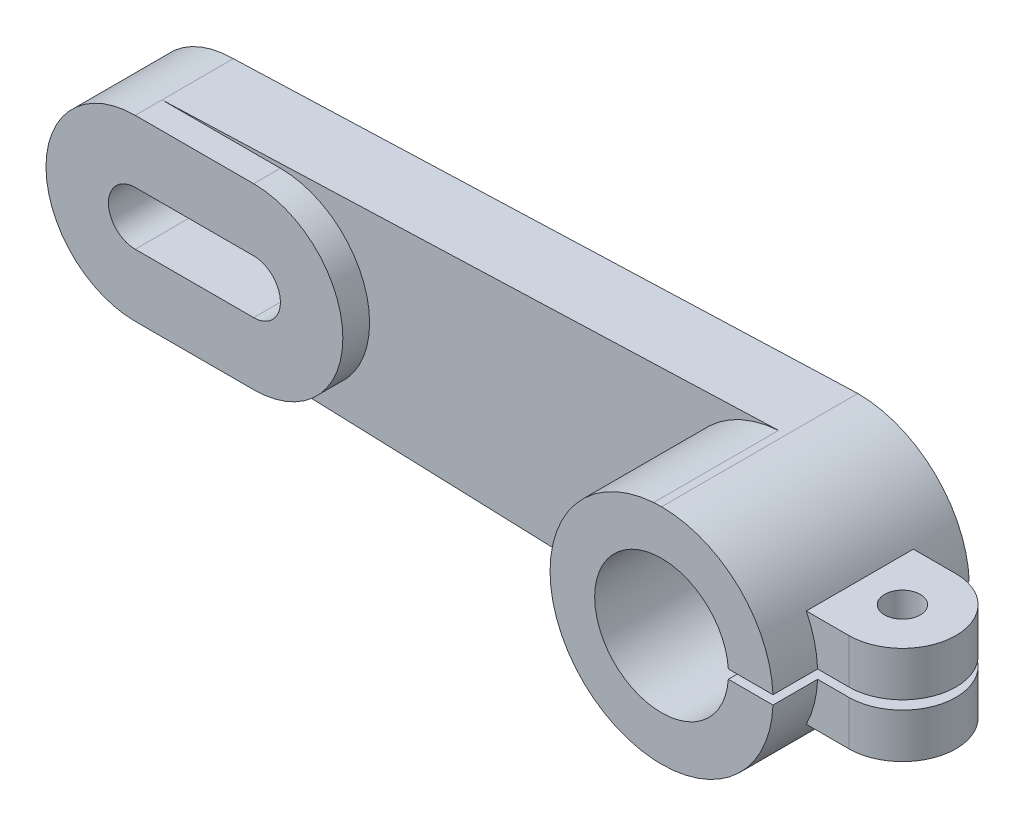
ISO-10303-21;
HEADER;
FILE_DESCRIPTION(('STEP AP214'),'2;1');
FILE_NAME('part.step','',(''),(''),'','','');
FILE_SCHEMA(('AUTOMOTIVE_DESIGN { 1 0 10303 214 1 1 1 1 }'));
ENDSEC;
DATA;
#1=APPLICATION_CONTEXT('core data for automotive mechanical design processes');
#2=APPLICATION_PROTOCOL_DEFINITION('international standard','automotive_design',2000,#1);
#3=PRODUCT_CONTEXT('',#1,'mechanical');
#4=PRODUCT('Part','Part','',(#3));
#5=PRODUCT_RELATED_PRODUCT_CATEGORY('part','',(#4));
#6=PRODUCT_DEFINITION_FORMATION('','',#4);
#7=PRODUCT_DEFINITION_CONTEXT('part definition',#1,'design');
#8=PRODUCT_DEFINITION('design','',#6,#7);
#9=PRODUCT_DEFINITION_SHAPE('','',#8);
#10=(LENGTH_UNIT() NAMED_UNIT(*) SI_UNIT(.MILLI.,.METRE.));
#11=(NAMED_UNIT(*) PLANE_ANGLE_UNIT() SI_UNIT($,.RADIAN.));
#12=(NAMED_UNIT(*) SI_UNIT($,.STERADIAN.) SOLID_ANGLE_UNIT());
#13=UNCERTAINTY_MEASURE_WITH_UNIT(LENGTH_MEASURE(1.E-05),#10,'distance_accuracy_value','');
#14=(GEOMETRIC_REPRESENTATION_CONTEXT(3) GLOBAL_UNCERTAINTY_ASSIGNED_CONTEXT((#13)) GLOBAL_UNIT_ASSIGNED_CONTEXT((#10,
#11,#12)) REPRESENTATION_CONTEXT('',''));
#15=CARTESIAN_POINT('',(0.,0.,0.));
#16=DIRECTION('',(0.,0.,1.));
#17=DIRECTION('',(1.,0.,0.));
#18=AXIS2_PLACEMENT_3D('',#15,#16,#17);
#19=CARTESIAN_POINT('',(140.,0.,16.));
#20=DIRECTION('',(0.,0.,-1.));
#21=DIRECTION('',(-1.,0.,0.));
#22=AXIS2_PLACEMENT_3D('',#19,#20,#21);
#23=CYLINDRICAL_SURFACE('',#22,25.);
#24=CARTESIAN_POINT('',(140.,0.,0.));
#25=DIRECTION('',(0.,0.,1.));
#26=DIRECTION('',(1.,0.,0.));
#27=AXIS2_PLACEMENT_3D('',#24,#25,#26);
#28=CIRCLE('',#27,25.);
#29=CARTESIAN_POINT('',(140.,-25.,0.));
#30=VERTEX_POINT('',#29);
#31=CARTESIAN_POINT('',(164.979991993594,-0.999999999999997,0.));
#32=VERTEX_POINT('',#31);
#33=EDGE_CURVE('E322',#30,#32,#28,.T.);
#34=ORIENTED_EDGE('',*,*,#33,.T.);
#35=DIRECTION('',(0.,0.,-1.));
#36=VECTOR('',#35,1.);
#37=CARTESIAN_POINT('',(164.979991993594,-0.999999999999997,16.));
#38=LINE('',#37,#36);
#39=CARTESIAN_POINT('',(164.979991993594,-0.999999999999997,9.99999999999999));
#40=VERTEX_POINT('',#39);
#41=EDGE_CURVE('E281',#32,#40,#38,.F.);
#42=ORIENTED_EDGE('',*,*,#41,.T.);
#43=CARTESIAN_POINT('',(140.,0.,9.99999999999999));
#44=DIRECTION('',(0.,0.,1.));
#45=DIRECTION('',(1.,0.,0.));
#46=AXIS2_PLACEMENT_3D('',#43,#44,#45);
#47=CIRCLE('',#46,25.);
#48=CARTESIAN_POINT('',(162.449944320644,-11.,9.99999999999999));
#49=VERTEX_POINT('',#48);
#50=EDGE_CURVE('E11',#49,#40,#47,.T.);
#51=ORIENTED_EDGE('',*,*,#50,.F.);
#52=DIRECTION('',(0.,0.,-1.));
#53=VECTOR('',#52,1.);
#54=CARTESIAN_POINT('',(162.449944320644,-11.,16.));
#55=LINE('',#54,#53);
#56=CARTESIAN_POINT('',(162.449944320644,-11.,34.));
#57=VERTEX_POINT('',#56);
#58=EDGE_CURVE('E346',#57,#49,#55,.T.);
#59=ORIENTED_EDGE('',*,*,#58,.F.);
#60=CARTESIAN_POINT('',(140.,0.,34.));
#61=DIRECTION('',(0.,0.,-1.));
#62=DIRECTION('',(-1.,0.,0.));
#63=AXIS2_PLACEMENT_3D('',#60,#61,#62);
#64=CIRCLE('',#63,25.);
#65=CARTESIAN_POINT('',(164.979991993594,-0.999999999999997,34.));
#66=VERTEX_POINT('',#65);
#67=EDGE_CURVE('E336',#66,#57,#64,.T.);
#68=ORIENTED_EDGE('',*,*,#67,.F.);
#69=CARTESIAN_POINT('',(164.979991993594,-0.999999999999997,44.));
#70=VERTEX_POINT('',#69);
#71=EDGE_CURVE('E62',#66,#70,#38,.F.);
#72=ORIENTED_EDGE('',*,*,#71,.T.);
#73=CARTESIAN_POINT('',(140.,0.,44.));
#74=DIRECTION('',(0.,0.,1.));
#75=DIRECTION('',(1.,0.,0.));
#76=AXIS2_PLACEMENT_3D('',#73,#74,#75);
#77=CIRCLE('',#76,25.);
#78=CARTESIAN_POINT('',(140.,-25.,44.));
#79=VERTEX_POINT('',#78);
#80=EDGE_CURVE('E232',#79,#70,#77,.T.);
#81=ORIENTED_EDGE('',*,*,#80,.F.);
#82=DIRECTION('',(0.,0.,-1.));
#83=VECTOR('',#82,1.);
#84=CARTESIAN_POINT('',(140.,-25.,16.));
#85=LINE('',#84,#83);
#86=EDGE_CURVE('E330',#79,#30,#85,.T.);
#87=ORIENTED_EDGE('',*,*,#86,.T.);
#88=EDGE_LOOP('',(#34,#42,#51,#59,#68,#72,#81,#87));
#89=FACE_BOUND('',#88,.T.);
#90=ADVANCED_FACE('F37',(#89),#23,.T.);
#91=CARTESIAN_POINT('',(172.,11.,22.));
#92=DIRECTION('',(0.,-1.,0.));
#93=DIRECTION('',(0.,0.,-1.));
#94=AXIS2_PLACEMENT_3D('',#91,#92,#93);
#95=CYLINDRICAL_SURFACE('',#94,12.);
#96=DIRECTION('',(0.,-1.,0.));
#97=VECTOR('',#96,1.);
#98=CARTESIAN_POINT('',(172.,11.,9.99999999999999));
#99=LINE('',#98,#97);
#100=CARTESIAN_POINT('',(172.,-0.999999999999997,9.99999999999999));
#101=VERTEX_POINT('',#100);
#102=CARTESIAN_POINT('',(172.,-11.,9.99999999999999));
#103=VERTEX_POINT('',#102);
#104=EDGE_CURVE('E251',#101,#103,#99,.T.);
#105=ORIENTED_EDGE('',*,*,#104,.F.);
#106=CARTESIAN_POINT('',(172.,-0.999999999999997,22.));
#107=DIRECTION('',(0.,-1.,0.));
#108=DIRECTION('',(0.,0.,-1.));
#109=AXIS2_PLACEMENT_3D('',#106,#107,#108);
#110=CIRCLE('',#109,12.);
#111=CARTESIAN_POINT('',(172.,-0.999999999999997,34.));
#112=VERTEX_POINT('',#111);
#113=EDGE_CURVE('E286',#101,#112,#110,.T.);
#114=ORIENTED_EDGE('',*,*,#113,.T.);
#115=DIRECTION('',(0.,-1.,0.));
#116=VECTOR('',#115,1.);
#117=CARTESIAN_POINT('',(172.,11.,34.));
#118=LINE('',#117,#116);
#119=CARTESIAN_POINT('',(172.,-11.,34.));
#120=VERTEX_POINT('',#119);
#121=EDGE_CURVE('E255',#112,#120,#118,.T.);
#122=ORIENTED_EDGE('',*,*,#121,.T.);
#123=CARTESIAN_POINT('',(172.,-11.,22.));
#124=DIRECTION('',(0.,1.,0.));
#125=DIRECTION('',(0.,0.,1.));
#126=AXIS2_PLACEMENT_3D('',#123,#124,#125);
#127=CIRCLE('',#126,12.);
#128=EDGE_CURVE('E263',#120,#103,#127,.T.);
#129=ORIENTED_EDGE('',*,*,#128,.T.);
#130=EDGE_LOOP('',(#105,#114,#122,#129));
#131=FACE_BOUND('',#130,.T.);
#132=ADVANCED_FACE('F400',(#131),#95,.T.);
#133=CARTESIAN_POINT('',(172.,11.,9.99999999999999));
#134=DIRECTION('',(0.,0.,1.));
#135=DIRECTION('',(1.,0.,0.));
#136=AXIS2_PLACEMENT_3D('',#133,#134,#135);
#137=PLANE('',#136);
#138=ORIENTED_EDGE('',*,*,#50,.T.);
#139=DIRECTION('',(1.,0.,0.));
#140=VECTOR('',#139,1.);
#141=CARTESIAN_POINT('',(172.,-0.999999999999997,9.99999999999999));
#142=LINE('',#141,#140);
#143=EDGE_CURVE('E282',#40,#101,#142,.T.);
#144=ORIENTED_EDGE('',*,*,#143,.T.);
#145=ORIENTED_EDGE('',*,*,#104,.T.);
#146=DIRECTION('',(-1.,0.,0.));
#147=VECTOR('',#146,1.);
#148=CARTESIAN_POINT('',(172.,-11.,9.99999999999999));
#149=LINE('',#148,#147);
#150=EDGE_CURVE('E260',#103,#49,#149,.T.);
#151=ORIENTED_EDGE('',*,*,#150,.T.);
#152=EDGE_LOOP('',(#138,#144,#145,#151));
#153=FACE_BOUND('',#152,.T.);
#154=ADVANCED_FACE('F405',(#153),#137,.F.);
#155=CARTESIAN_POINT('',(172.,11.,34.));
#156=DIRECTION('',(0.,0.,-1.));
#157=DIRECTION('',(-1.,0.,0.));
#158=AXIS2_PLACEMENT_3D('',#155,#156,#157);
#159=PLANE('',#158);
#160=ORIENTED_EDGE('',*,*,#121,.F.);
#161=DIRECTION('',(-1.,0.,0.));
#162=VECTOR('',#161,1.);
#163=CARTESIAN_POINT('',(172.,-0.999999999999997,34.));
#164=LINE('',#163,#162);
#165=EDGE_CURVE('E289',#112,#66,#164,.T.);
#166=ORIENTED_EDGE('',*,*,#165,.T.);
#167=ORIENTED_EDGE('',*,*,#67,.T.);
#168=DIRECTION('',(1.,0.,0.));
#169=VECTOR('',#168,1.);
#170=CARTESIAN_POINT('',(172.,-11.,34.));
#171=LINE('',#170,#169);
#172=EDGE_CURVE('E256',#57,#120,#171,.T.);
#173=ORIENTED_EDGE('',*,*,#172,.T.);
#174=EDGE_LOOP('',(#160,#166,#167,#173));
#175=FACE_BOUND('',#174,.T.);
#176=ADVANCED_FACE('F419',(#175),#159,.F.);
#177=CARTESIAN_POINT('',(172.,11.,22.));
#178=DIRECTION('',(0.,-1.,0.));
#179=DIRECTION('',(0.,0.,-1.));
#180=AXIS2_PLACEMENT_3D('',#177,#178,#179);
#181=CYLINDRICAL_SURFACE('',#180,3.99999999999999);
#182=CARTESIAN_POINT('',(172.,-0.999999999999997,22.));
#183=DIRECTION('',(0.,-1.,0.));
#184=DIRECTION('',(0.,0.,-1.));
#185=AXIS2_PLACEMENT_3D('',#182,#183,#184);
#186=CIRCLE('',#185,3.99999999999999);
#187=CARTESIAN_POINT('',(172.,-0.999999999999997,18.));
#188=VERTEX_POINT('',#187);
#189=EDGE_CURVE('E41',#188,#188,#186,.T.);
#190=ORIENTED_EDGE('',*,*,#189,.F.);
#191=EDGE_LOOP('',(#190));
#192=FACE_BOUND('',#191,.T.);
#193=CARTESIAN_POINT('',(172.,-11.,22.));
#194=DIRECTION('',(0.,1.,0.));
#195=DIRECTION('',(0.,0.,1.));
#196=AXIS2_PLACEMENT_3D('',#193,#194,#195);
#197=CIRCLE('',#196,3.99999999999999);
#198=CARTESIAN_POINT('',(172.,-11.,26.));
#199=VERTEX_POINT('',#198);
#200=EDGE_CURVE('E274',#199,#199,#197,.T.);
#201=ORIENTED_EDGE('',*,*,#200,.F.);
#202=EDGE_LOOP('',(#201));
#203=FACE_BOUND('',#202,.T.);
#204=ADVANCED_FACE('F359',(#192,#203),#181,.F.);
#205=CARTESIAN_POINT('',(164.979991993594,1.,44.));
#206=VERTEX_POINT('',#205);
#207=CARTESIAN_POINT('',(140.,25.,44.));
#208=VERTEX_POINT('',#207);
#209=EDGE_CURVE('E222',#206,#208,#77,.T.);
#210=ORIENTED_EDGE('',*,*,#209,.F.);
#211=DIRECTION('',(0.,0.,-1.));
#212=VECTOR('',#211,1.);
#213=CARTESIAN_POINT('',(164.979991993594,1.,16.));
#214=LINE('',#213,#212);
#215=CARTESIAN_POINT('',(164.979991993594,1.,34.));
#216=VERTEX_POINT('',#215);
#217=EDGE_CURVE('E204',#206,#216,#214,.T.);
#218=ORIENTED_EDGE('',*,*,#217,.T.);
#219=CARTESIAN_POINT('',(162.449944320644,11.,34.));
#220=VERTEX_POINT('',#219);
#221=EDGE_CURVE('E344',#220,#216,#64,.T.);
#222=ORIENTED_EDGE('',*,*,#221,.F.);
#223=DIRECTION('',(0.,0.,-1.));
#224=VECTOR('',#223,1.);
#225=CARTESIAN_POINT('',(162.449944320644,11.,16.));
#226=LINE('',#225,#224);
#227=CARTESIAN_POINT('',(162.449944320644,11.,9.99999999999999));
#228=VERTEX_POINT('',#227);
#229=EDGE_CURVE('E349',#220,#228,#226,.T.);
#230=ORIENTED_EDGE('',*,*,#229,.T.);
#231=CARTESIAN_POINT('',(164.979991993594,1.,9.99999999999999));
#232=VERTEX_POINT('',#231);
#233=EDGE_CURVE('E46',#232,#228,#47,.T.);
#234=ORIENTED_EDGE('',*,*,#233,.F.);
#235=CARTESIAN_POINT('',(164.979991993594,1.,0.));
#236=VERTEX_POINT('',#235);
#237=EDGE_CURVE('E216',#232,#236,#214,.T.);
#238=ORIENTED_EDGE('',*,*,#237,.T.);
#239=CARTESIAN_POINT('',(140.,25.,0.));
#240=VERTEX_POINT('',#239);
#241=EDGE_CURVE('E312',#236,#240,#28,.T.);
#242=ORIENTED_EDGE('',*,*,#241,.T.);
#243=DIRECTION('',(0.,0.,-1.));
#244=VECTOR('',#243,1.);
#245=CARTESIAN_POINT('',(140.,25.,16.));
#246=LINE('',#245,#244);
#247=EDGE_CURVE('E230',#208,#240,#246,.T.);
#248=ORIENTED_EDGE('',*,*,#247,.F.);
#249=EDGE_LOOP('',(#210,#218,#222,#230,#234,#238,#242,#248));
#250=FACE_BOUND('',#249,.T.);
#251=ADVANCED_FACE('F228',(#250),#23,.T.);
#252=CARTESIAN_POINT('',(0.,0.,16.));
#253=DIRECTION('',(0.,0.,1.));
#254=DIRECTION('',(1.,0.,0.));
#255=AXIS2_PLACEMENT_3D('',#252,#253,#254);
#256=PLANE('',#255);
#257=DIRECTION('',(0.99936285434755,-0.0356915305124125,0.));
#258=VECTOR('',#257,1.);
#259=CARTESIAN_POINT('',(-0.713375796178345,-19.9745222929936,16.));
#260=LINE('',#259,#258);
#261=CARTESIAN_POINT('',(0.,-20.,16.));
#262=VERTEX_POINT('',#261);
#263=CARTESIAN_POINT('',(138.216560509554,-24.9363057324841,16.));
#264=VERTEX_POINT('',#263);
#265=EDGE_CURVE('E317',#262,#264,#260,.T.);
#266=ORIENTED_EDGE('',*,*,#265,.T.);
#267=CARTESIAN_POINT('',(140.,0.,16.));
#268=DIRECTION('',(0.,0.,1.));
#269=DIRECTION('',(1.,0.,0.));
#270=AXIS2_PLACEMENT_3D('',#267,#268,#269);
#271=CIRCLE('',#270,25.);
#272=CARTESIAN_POINT('',(138.216560509554,24.9363057324841,16.));
#273=VERTEX_POINT('',#272);
#274=EDGE_CURVE('E737',#264,#273,#271,.F.);
#275=ORIENTED_EDGE('',*,*,#274,.T.);
#276=DIRECTION('',(0.99936285434755,0.0356915305124125,0.));
#277=VECTOR('',#276,1.);
#278=CARTESIAN_POINT('',(-0.713375796178345,19.9745222929936,16.));
#279=LINE('',#278,#277);
#280=CARTESIAN_POINT('',(0.,20.,16.));
#281=VERTEX_POINT('',#280);
#282=EDGE_CURVE('E320',#281,#273,#279,.T.);
#283=ORIENTED_EDGE('',*,*,#282,.F.);
#284=DIRECTION('',(-1.,0.,0.));
#285=VECTOR('',#284,1.);
#286=CARTESIAN_POINT('',(0.,20.,16.));
#287=LINE('',#286,#285);
#288=CARTESIAN_POINT('',(26.54731064764,20.,16.));
#289=VERTEX_POINT('',#288);
#290=EDGE_CURVE('E734',#289,#281,#287,.T.);
#291=ORIENTED_EDGE('',*,*,#290,.F.);
#292=CARTESIAN_POINT('',(26.54731064764,0.,16.));
#293=DIRECTION('',(0.,0.,1.));
#294=DIRECTION('',(1.,0.,0.));
#295=AXIS2_PLACEMENT_3D('',#292,#293,#294);
#296=CIRCLE('',#295,20.);
#297=CARTESIAN_POINT('',(26.54731064764,-20.,16.));
#298=VERTEX_POINT('',#297);
#299=EDGE_CURVE('E743',#289,#298,#296,.F.);
#300=ORIENTED_EDGE('',*,*,#299,.T.);
#301=DIRECTION('',(-1.,0.,0.));
#302=VECTOR('',#301,1.);
#303=CARTESIAN_POINT('',(0.,-20.,16.));
#304=LINE('',#303,#302);
#305=EDGE_CURVE('E746',#298,#262,#304,.T.);
#306=ORIENTED_EDGE('',*,*,#305,.T.);
#307=EDGE_LOOP('',(#266,#275,#283,#291,#300,#306));
#308=FACE_BOUND('',#307,.T.);
#309=ADVANCED_FACE('F411',(#308),#256,.T.);
#310=CARTESIAN_POINT('',(0.,0.,16.));
#311=DIRECTION('',(0.,0.,-1.));
#312=DIRECTION('',(-1.,0.,0.));
#313=AXIS2_PLACEMENT_3D('',#310,#311,#312);
#314=CYLINDRICAL_SURFACE('',#313,20.);
#315=CARTESIAN_POINT('',(0.,0.,0.));
#316=DIRECTION('',(0.,0.,1.));
#317=DIRECTION('',(1.,0.,0.));
#318=AXIS2_PLACEMENT_3D('',#315,#316,#317);
#319=CIRCLE('',#318,20.);
#320=CARTESIAN_POINT('',(0.,20.,0.));
#321=VERTEX_POINT('',#320);
#322=CARTESIAN_POINT('',(0.,-20.,0.));
#323=VERTEX_POINT('',#322);
#324=EDGE_CURVE('E382',#321,#323,#319,.T.);
#325=ORIENTED_EDGE('',*,*,#324,.T.);
#326=DIRECTION('',(0.,0.,-1.));
#327=VECTOR('',#326,1.);
#328=CARTESIAN_POINT('',(0.,-20.,16.));
#329=LINE('',#328,#327);
#330=EDGE_CURVE('E333',#262,#323,#329,.T.);
#331=ORIENTED_EDGE('',*,*,#330,.F.);
#332=DIRECTION('',(0.,0.,-1.));
#333=VECTOR('',#332,1.);
#334=CARTESIAN_POINT('',(0.,-20.,22.));
#335=LINE('',#334,#333);
#336=CARTESIAN_POINT('',(0.,-20.,22.));
#337=VERTEX_POINT('',#336);
#338=EDGE_CURVE('E776',#337,#262,#335,.T.);
#339=ORIENTED_EDGE('',*,*,#338,.F.);
#340=CARTESIAN_POINT('',(0.,0.,22.));
#341=DIRECTION('',(0.,0.,1.));
#342=DIRECTION('',(1.,0.,0.));
#343=AXIS2_PLACEMENT_3D('',#340,#341,#342);
#344=CIRCLE('',#343,20.);
#345=CARTESIAN_POINT('',(0.,20.,22.));
#346=VERTEX_POINT('',#345);
#347=EDGE_CURVE('E774',#346,#337,#344,.T.);
#348=ORIENTED_EDGE('',*,*,#347,.F.);
#349=DIRECTION('',(0.,0.,-1.));
#350=VECTOR('',#349,1.);
#351=CARTESIAN_POINT('',(0.,20.,22.));
#352=LINE('',#351,#350);
#353=EDGE_CURVE('E729',#346,#281,#352,.T.);
#354=ORIENTED_EDGE('',*,*,#353,.T.);
#355=DIRECTION('',(0.,0.,-1.));
#356=VECTOR('',#355,1.);
#357=CARTESIAN_POINT('',(0.,20.,16.));
#358=LINE('',#357,#356);
#359=EDGE_CURVE('E326',#281,#321,#358,.T.);
#360=ORIENTED_EDGE('',*,*,#359,.T.);
#361=EDGE_LOOP('',(#325,#331,#339,#348,#354,#360));
#362=FACE_BOUND('',#361,.T.);
#363=ADVANCED_FACE('F416',(#362),#314,.T.);
#364=CARTESIAN_POINT('',(-0.713375796178345,-19.9745222929936,16.));
#365=DIRECTION('',(0.0356915305124125,0.999362854347549,0.));
#366=DIRECTION('',(-0.99936285434755,0.0356915305124125,0.));
#367=AXIS2_PLACEMENT_3D('',#364,#365,#366);
#368=PLANE('',#367);
#369=ORIENTED_EDGE('',*,*,#86,.F.);
#370=DIRECTION('',(0.99936285434755,-0.0356915305124125,0.));
#371=VECTOR('',#370,1.);
#372=CARTESIAN_POINT('',(-0.713375796178345,-19.9745222929936,44.));
#373=LINE('',#372,#371);
#374=CARTESIAN_POINT('',(138.216560509554,-24.9363057324841,44.));
#375=VERTEX_POINT('',#374);
#376=EDGE_CURVE('E233',#375,#79,#373,.T.);
#377=ORIENTED_EDGE('',*,*,#376,.F.);
#378=DIRECTION('',(0.,0.,-1.));
#379=VECTOR('',#378,1.);
#380=CARTESIAN_POINT('',(138.216560509554,-24.9363057324841,44.));
#381=LINE('',#380,#379);
#382=EDGE_CURVE('E237',#375,#264,#381,.T.);
#383=ORIENTED_EDGE('',*,*,#382,.T.);
#384=ORIENTED_EDGE('',*,*,#265,.F.);
#385=ORIENTED_EDGE('',*,*,#330,.T.);
#386=DIRECTION('',(0.99936285434755,-0.0356915305124125,0.));
#387=VECTOR('',#386,1.);
#388=CARTESIAN_POINT('',(-0.713375796178345,-19.9745222929936,0.));
#389=LINE('',#388,#387);
#390=EDGE_CURVE('E378',#323,#30,#389,.T.);
#391=ORIENTED_EDGE('',*,*,#390,.T.);
#392=EDGE_LOOP('',(#369,#377,#383,#384,#385,#391));
#393=FACE_BOUND('',#392,.T.);
#394=ADVANCED_FACE('F607',(#393),#368,.F.);
#395=CARTESIAN_POINT('',(26.54731064764,0.,16.));
#396=DIRECTION('',(0.,0.,-1.));
#397=DIRECTION('',(-1.,0.,0.));
#398=AXIS2_PLACEMENT_3D('',#395,#396,#397);
#399=CYLINDRICAL_SURFACE('',#398,6.);
#400=CARTESIAN_POINT('',(26.54731064764,0.,0.));
#401=DIRECTION('',(0.,0.,1.));
#402=DIRECTION('',(1.,0.,0.));
#403=AXIS2_PLACEMENT_3D('',#400,#401,#402);
#404=CIRCLE('',#403,6.);
#405=CARTESIAN_POINT('',(26.54731064764,-6.,0.));
#406=VERTEX_POINT('',#405);
#407=CARTESIAN_POINT('',(26.54731064764,6.,0.));
#408=VERTEX_POINT('',#407);
#409=EDGE_CURVE('E700',#406,#408,#404,.T.);
#410=ORIENTED_EDGE('',*,*,#409,.F.);
#411=DIRECTION('',(0.,0.,-1.));
#412=VECTOR('',#411,1.);
#413=CARTESIAN_POINT('',(26.54731064764,-6.,16.));
#414=LINE('',#413,#412);
#415=CARTESIAN_POINT('',(26.54731064764,-6.,22.));
#416=VERTEX_POINT('',#415);
#417=EDGE_CURVE('E328',#416,#406,#414,.T.);
#418=ORIENTED_EDGE('',*,*,#417,.F.);
#419=CARTESIAN_POINT('',(26.54731064764,0.,22.));
#420=DIRECTION('',(0.,0.,1.));
#421=DIRECTION('',(1.,0.,0.));
#422=AXIS2_PLACEMENT_3D('',#419,#420,#421);
#423=CIRCLE('',#422,6.);
#424=CARTESIAN_POINT('',(26.54731064764,6.,22.));
#425=VERTEX_POINT('',#424);
#426=EDGE_CURVE('E754',#416,#425,#423,.T.);
#427=ORIENTED_EDGE('',*,*,#426,.T.);
#428=DIRECTION('',(0.,0.,-1.));
#429=VECTOR('',#428,1.);
#430=CARTESIAN_POINT('',(26.54731064764,6.,16.));
#431=LINE('',#430,#429);
#432=EDGE_CURVE('E337',#425,#408,#431,.T.);
#433=ORIENTED_EDGE('',*,*,#432,.T.);
#434=EDGE_LOOP('',(#410,#418,#427,#433));
#435=FACE_BOUND('',#434,.T.);
#436=ADVANCED_FACE('F39',(#435),#399,.F.);
#437=CARTESIAN_POINT('',(0.,-6.,16.));
#438=DIRECTION('',(0.,1.,0.));
#439=DIRECTION('',(0.,0.,1.));
#440=AXIS2_PLACEMENT_3D('',#437,#438,#439);
#441=PLANE('',#440);
#442=DIRECTION('',(1.,0.,0.));
#443=VECTOR('',#442,1.);
#444=CARTESIAN_POINT('',(0.,-6.,0.));
#445=LINE('',#444,#443);
#446=CARTESIAN_POINT('',(0.,-6.,0.));
#447=VERTEX_POINT('',#446);
#448=EDGE_CURVE('E693',#447,#406,#445,.T.);
#449=ORIENTED_EDGE('',*,*,#448,.F.);
#450=DIRECTION('',(0.,0.,-1.));
#451=VECTOR('',#450,1.);
#452=CARTESIAN_POINT('',(0.,-6.,16.));
#453=LINE('',#452,#451);
#454=CARTESIAN_POINT('',(0.,-6.,22.));
#455=VERTEX_POINT('',#454);
#456=EDGE_CURVE('E341',#455,#447,#453,.T.);
#457=ORIENTED_EDGE('',*,*,#456,.F.);
#458=DIRECTION('',(1.,0.,0.));
#459=VECTOR('',#458,1.);
#460=CARTESIAN_POINT('',(0.,-6.,22.));
#461=LINE('',#460,#459);
#462=EDGE_CURVE('E761',#455,#416,#461,.T.);
#463=ORIENTED_EDGE('',*,*,#462,.T.);
#464=ORIENTED_EDGE('',*,*,#417,.T.);
#465=EDGE_LOOP('',(#449,#457,#463,#464));
#466=FACE_BOUND('',#465,.T.);
#467=ADVANCED_FACE('F394',(#466),#441,.T.);
#468=CARTESIAN_POINT('',(0.,0.,16.));
#469=DIRECTION('',(0.,0.,-1.));
#470=DIRECTION('',(-1.,0.,0.));
#471=AXIS2_PLACEMENT_3D('',#468,#469,#470);
#472=CYLINDRICAL_SURFACE('',#471,6.);
#473=CARTESIAN_POINT('',(0.,0.,0.));
#474=DIRECTION('',(0.,0.,1.));
#475=DIRECTION('',(1.,0.,0.));
#476=AXIS2_PLACEMENT_3D('',#473,#474,#475);
#477=CIRCLE('',#476,6.);
#478=CARTESIAN_POINT('',(0.,6.,0.));
#479=VERTEX_POINT('',#478);
#480=EDGE_CURVE('E699',#479,#447,#477,.T.);
#481=ORIENTED_EDGE('',*,*,#480,.F.);
#482=DIRECTION('',(0.,0.,-1.));
#483=VECTOR('',#482,1.);
#484=CARTESIAN_POINT('',(0.,6.,16.));
#485=LINE('',#484,#483);
#486=CARTESIAN_POINT('',(0.,6.,22.));
#487=VERTEX_POINT('',#486);
#488=EDGE_CURVE('E339',#487,#479,#485,.T.);
#489=ORIENTED_EDGE('',*,*,#488,.F.);
#490=CARTESIAN_POINT('',(0.,0.,22.));
#491=DIRECTION('',(0.,0.,1.));
#492=DIRECTION('',(1.,0.,0.));
#493=AXIS2_PLACEMENT_3D('',#490,#491,#492);
#494=CIRCLE('',#493,6.);
#495=EDGE_CURVE('E760',#487,#455,#494,.T.);
#496=ORIENTED_EDGE('',*,*,#495,.T.);
#497=ORIENTED_EDGE('',*,*,#456,.T.);
#498=EDGE_LOOP('',(#481,#489,#496,#497));
#499=FACE_BOUND('',#498,.T.);
#500=ADVANCED_FACE('F386',(#499),#472,.F.);
#501=CARTESIAN_POINT('',(-0.713375796178345,19.9745222929936,16.));
#502=DIRECTION('',(-0.0356915305124125,0.999362854347549,0.));
#503=DIRECTION('',(-0.99936285434755,-0.0356915305124125,0.));
#504=AXIS2_PLACEMENT_3D('',#501,#502,#503);
#505=PLANE('',#504);
#506=ORIENTED_EDGE('',*,*,#247,.T.);
#507=DIRECTION('',(0.99936285434755,0.0356915305124125,0.));
#508=VECTOR('',#507,1.);
#509=CARTESIAN_POINT('',(-0.713375796178345,19.9745222929936,0.));
#510=LINE('',#509,#508);
#511=EDGE_CURVE('E318',#321,#240,#510,.T.);
#512=ORIENTED_EDGE('',*,*,#511,.F.);
#513=ORIENTED_EDGE('',*,*,#359,.F.);
#514=ORIENTED_EDGE('',*,*,#282,.T.);
#515=DIRECTION('',(0.,0.,-1.));
#516=VECTOR('',#515,1.);
#517=CARTESIAN_POINT('',(138.216560509554,24.9363057324841,44.));
#518=LINE('',#517,#516);
#519=CARTESIAN_POINT('',(138.216560509554,24.9363057324841,44.));
#520=VERTEX_POINT('',#519);
#521=EDGE_CURVE('E784',#520,#273,#518,.T.);
#522=ORIENTED_EDGE('',*,*,#521,.F.);
#523=DIRECTION('',(0.99936285434755,0.0356915305124125,0.));
#524=VECTOR('',#523,1.);
#525=CARTESIAN_POINT('',(-0.713375796178345,19.9745222929936,44.));
#526=LINE('',#525,#524);
#527=EDGE_CURVE('E242',#520,#208,#526,.T.);
#528=ORIENTED_EDGE('',*,*,#527,.T.);
#529=EDGE_LOOP('',(#506,#512,#513,#514,#522,#528));
#530=FACE_BOUND('',#529,.T.);
#531=ADVANCED_FACE('F383',(#530),#505,.T.);
#532=CARTESIAN_POINT('',(0.,6.,16.));
#533=DIRECTION('',(0.,1.,0.));
#534=DIRECTION('',(0.,0.,1.));
#535=AXIS2_PLACEMENT_3D('',#532,#533,#534);
#536=PLANE('',#535);
#537=DIRECTION('',(1.,0.,0.));
#538=VECTOR('',#537,1.);
#539=CARTESIAN_POINT('',(0.,6.,0.));
#540=LINE('',#539,#538);
#541=EDGE_CURVE('E705',#479,#408,#540,.T.);
#542=ORIENTED_EDGE('',*,*,#541,.T.);
#543=ORIENTED_EDGE('',*,*,#432,.F.);
#544=DIRECTION('',(1.,0.,0.));
#545=VECTOR('',#544,1.);
#546=CARTESIAN_POINT('',(0.,6.,22.));
#547=LINE('',#546,#545);
#548=EDGE_CURVE('E757',#487,#425,#547,.T.);
#549=ORIENTED_EDGE('',*,*,#548,.F.);
#550=ORIENTED_EDGE('',*,*,#488,.T.);
#551=EDGE_LOOP('',(#542,#543,#549,#550));
#552=FACE_BOUND('',#551,.T.);
#553=ADVANCED_FACE('F385',(#552),#536,.F.);
#554=CARTESIAN_POINT('',(140.,0.,16.));
#555=DIRECTION('',(0.,0.,-1.));
#556=DIRECTION('',(-1.,0.,0.));
#557=AXIS2_PLACEMENT_3D('',#554,#555,#556);
#558=CYLINDRICAL_SURFACE('',#557,15.);
#559=DIRECTION('',(0.,0.,-1.));
#560=VECTOR('',#559,1.);
#561=CARTESIAN_POINT('',(154.966629547096,-0.999999999999997,16.));
#562=LINE('',#561,#560);
#563=CARTESIAN_POINT('',(154.966629547096,-0.999999999999997,0.));
#564=VERTEX_POINT('',#563);
#565=CARTESIAN_POINT('',(154.966629547096,-0.999999999999997,44.));
#566=VERTEX_POINT('',#565);
#567=EDGE_CURVE('E277',#564,#566,#562,.F.);
#568=ORIENTED_EDGE('',*,*,#567,.F.);
#569=CARTESIAN_POINT('',(140.,0.,0.));
#570=DIRECTION('',(0.,0.,1.));
#571=DIRECTION('',(1.,0.,0.));
#572=AXIS2_PLACEMENT_3D('',#569,#570,#571);
#573=CIRCLE('',#572,15.);
#574=CARTESIAN_POINT('',(154.966629547096,1.,0.));
#575=VERTEX_POINT('',#574);
#576=EDGE_CURVE('E310',#575,#564,#573,.T.);
#577=ORIENTED_EDGE('',*,*,#576,.F.);
#578=DIRECTION('',(0.,0.,-1.));
#579=VECTOR('',#578,1.);
#580=CARTESIAN_POINT('',(154.966629547096,1.,16.));
#581=LINE('',#580,#579);
#582=CARTESIAN_POINT('',(154.966629547096,1.,44.));
#583=VERTEX_POINT('',#582);
#584=EDGE_CURVE('E291',#583,#575,#581,.T.);
#585=ORIENTED_EDGE('',*,*,#584,.F.);
#586=CARTESIAN_POINT('',(140.,0.,44.));
#587=DIRECTION('',(0.,0.,1.));
#588=DIRECTION('',(1.,0.,0.));
#589=AXIS2_PLACEMENT_3D('',#586,#587,#588);
#590=CIRCLE('',#589,15.);
#591=EDGE_CURVE('E225',#583,#566,#590,.T.);
#592=ORIENTED_EDGE('',*,*,#591,.T.);
#593=EDGE_LOOP('',(#568,#577,#585,#592));
#594=FACE_BOUND('',#593,.T.);
#595=ADVANCED_FACE('F316',(#594),#558,.F.);
#596=CARTESIAN_POINT('',(0.,0.,0.));
#597=DIRECTION('',(0.,0.,1.));
#598=DIRECTION('',(1.,0.,0.));
#599=AXIS2_PLACEMENT_3D('',#596,#597,#598);
#600=PLANE('',#599);
#601=ORIENTED_EDGE('',*,*,#576,.T.);
#602=DIRECTION('',(1.,0.,0.));
#603=VECTOR('',#602,1.);
#604=CARTESIAN_POINT('',(140.,-0.999999999999997,0.));
#605=LINE('',#604,#603);
#606=EDGE_CURVE('E300',#564,#32,#605,.T.);
#607=ORIENTED_EDGE('',*,*,#606,.T.);
#608=ORIENTED_EDGE('',*,*,#33,.F.);
#609=ORIENTED_EDGE('',*,*,#390,.F.);
#610=ORIENTED_EDGE('',*,*,#324,.F.);
#611=ORIENTED_EDGE('',*,*,#511,.T.);
#612=ORIENTED_EDGE('',*,*,#241,.F.);
#613=DIRECTION('',(-1.,0.,0.));
#614=VECTOR('',#613,1.);
#615=CARTESIAN_POINT('',(140.,1.,0.));
#616=LINE('',#615,#614);
#617=EDGE_CURVE('E298',#236,#575,#616,.T.);
#618=ORIENTED_EDGE('',*,*,#617,.T.);
#619=EDGE_LOOP('',(#601,#607,#608,#609,#610,#611,#612,#618));
#620=FACE_BOUND('',#619,.T.);
#621=ORIENTED_EDGE('',*,*,#409,.T.);
#622=ORIENTED_EDGE('',*,*,#541,.F.);
#623=ORIENTED_EDGE('',*,*,#480,.T.);
#624=ORIENTED_EDGE('',*,*,#448,.T.);
#625=EDGE_LOOP('',(#621,#622,#623,#624));
#626=FACE_BOUND('',#625,.T.);
#627=ADVANCED_FACE('F308',(#620,#626),#600,.F.);
#628=CARTESIAN_POINT('',(0.,-20.,22.));
#629=DIRECTION('',(0.,1.,0.));
#630=DIRECTION('',(0.,0.,1.));
#631=AXIS2_PLACEMENT_3D('',#628,#629,#630);
#632=PLANE('',#631);
#633=ORIENTED_EDGE('',*,*,#305,.F.);
#634=DIRECTION('',(0.,0.,-1.));
#635=VECTOR('',#634,1.);
#636=CARTESIAN_POINT('',(26.54731064764,-20.,22.));
#637=LINE('',#636,#635);
#638=CARTESIAN_POINT('',(26.54731064764,-20.,22.));
#639=VERTEX_POINT('',#638);
#640=EDGE_CURVE('E744',#639,#298,#637,.T.);
#641=ORIENTED_EDGE('',*,*,#640,.F.);
#642=DIRECTION('',(1.,0.,0.));
#643=VECTOR('',#642,1.);
#644=CARTESIAN_POINT('',(0.,-20.,22.));
#645=LINE('',#644,#643);
#646=EDGE_CURVE('E763',#337,#639,#645,.T.);
#647=ORIENTED_EDGE('',*,*,#646,.F.);
#648=ORIENTED_EDGE('',*,*,#338,.T.);
#649=EDGE_LOOP('',(#633,#641,#647,#648));
#650=FACE_BOUND('',#649,.T.);
#651=ADVANCED_FACE('F455',(#650),#632,.F.);
#652=CARTESIAN_POINT('',(26.54731064764,0.,22.));
#653=DIRECTION('',(0.,0.,-1.));
#654=DIRECTION('',(-1.,0.,0.));
#655=AXIS2_PLACEMENT_3D('',#652,#653,#654);
#656=CYLINDRICAL_SURFACE('',#655,20.);
#657=ORIENTED_EDGE('',*,*,#299,.F.);
#658=DIRECTION('',(0.,0.,-1.));
#659=VECTOR('',#658,1.);
#660=CARTESIAN_POINT('',(26.54731064764,20.,22.));
#661=LINE('',#660,#659);
#662=CARTESIAN_POINT('',(26.54731064764,20.,22.));
#663=VERTEX_POINT('',#662);
#664=EDGE_CURVE('E742',#663,#289,#661,.T.);
#665=ORIENTED_EDGE('',*,*,#664,.F.);
#666=CARTESIAN_POINT('',(26.54731064764,0.,22.));
#667=DIRECTION('',(0.,0.,1.));
#668=DIRECTION('',(1.,0.,0.));
#669=AXIS2_PLACEMENT_3D('',#666,#667,#668);
#670=CIRCLE('',#669,20.);
#671=EDGE_CURVE('E770',#639,#663,#670,.T.);
#672=ORIENTED_EDGE('',*,*,#671,.F.);
#673=ORIENTED_EDGE('',*,*,#640,.T.);
#674=EDGE_LOOP('',(#657,#665,#672,#673));
#675=FACE_BOUND('',#674,.T.);
#676=ADVANCED_FACE('F451',(#675),#656,.T.);
#677=CARTESIAN_POINT('',(0.,20.,22.));
#678=DIRECTION('',(0.,1.,0.));
#679=DIRECTION('',(0.,0.,1.));
#680=AXIS2_PLACEMENT_3D('',#677,#678,#679);
#681=PLANE('',#680);
#682=ORIENTED_EDGE('',*,*,#664,.T.);
#683=ORIENTED_EDGE('',*,*,#290,.T.);
#684=ORIENTED_EDGE('',*,*,#353,.F.);
#685=DIRECTION('',(1.,0.,0.));
#686=VECTOR('',#685,1.);
#687=CARTESIAN_POINT('',(0.,20.,22.));
#688=LINE('',#687,#686);
#689=EDGE_CURVE('E772',#346,#663,#688,.T.);
#690=ORIENTED_EDGE('',*,*,#689,.T.);
#691=EDGE_LOOP('',(#682,#683,#684,#690));
#692=FACE_BOUND('',#691,.T.);
#693=ADVANCED_FACE('F447',(#692),#681,.T.);
#694=CARTESIAN_POINT('',(0.,0.,22.));
#695=DIRECTION('',(0.,0.,1.));
#696=DIRECTION('',(1.,0.,0.));
#697=AXIS2_PLACEMENT_3D('',#694,#695,#696);
#698=PLANE('',#697);
#699=ORIENTED_EDGE('',*,*,#426,.F.);
#700=ORIENTED_EDGE('',*,*,#462,.F.);
#701=ORIENTED_EDGE('',*,*,#495,.F.);
#702=ORIENTED_EDGE('',*,*,#548,.T.);
#703=EDGE_LOOP('',(#699,#700,#701,#702));
#704=FACE_BOUND('',#703,.T.);
#705=ORIENTED_EDGE('',*,*,#646,.T.);
#706=ORIENTED_EDGE('',*,*,#671,.T.);
#707=ORIENTED_EDGE('',*,*,#689,.F.);
#708=ORIENTED_EDGE('',*,*,#347,.T.);
#709=EDGE_LOOP('',(#705,#706,#707,#708));
#710=FACE_BOUND('',#709,.T.);
#711=ADVANCED_FACE('F443',(#704,#710),#698,.T.);
#712=CARTESIAN_POINT('',(140.,0.,44.));
#713=DIRECTION('',(0.,0.,-1.));
#714=DIRECTION('',(-1.,0.,0.));
#715=AXIS2_PLACEMENT_3D('',#712,#713,#714);
#716=CYLINDRICAL_SURFACE('',#715,25.);
#717=ORIENTED_EDGE('',*,*,#274,.F.);
#718=ORIENTED_EDGE('',*,*,#382,.F.);
#719=EDGE_CURVE('E235',#520,#375,#77,.T.);
#720=ORIENTED_EDGE('',*,*,#719,.F.);
#721=ORIENTED_EDGE('',*,*,#521,.T.);
#722=EDGE_LOOP('',(#717,#718,#720,#721));
#723=FACE_BOUND('',#722,.T.);
#724=ADVANCED_FACE('F440',(#723),#716,.T.);
#725=CARTESIAN_POINT('',(0.,0.,44.));
#726=DIRECTION('',(0.,0.,1.));
#727=DIRECTION('',(1.,0.,0.));
#728=AXIS2_PLACEMENT_3D('',#725,#726,#727);
#729=PLANE('',#728);
#730=DIRECTION('',(1.,0.,0.));
#731=VECTOR('',#730,1.);
#732=CARTESIAN_POINT('',(140.,-0.999999999999997,44.));
#733=LINE('',#732,#731);
#734=EDGE_CURVE('E226',#566,#70,#733,.T.);
#735=ORIENTED_EDGE('',*,*,#734,.F.);
#736=ORIENTED_EDGE('',*,*,#591,.F.);
#737=DIRECTION('',(-1.,0.,0.));
#738=VECTOR('',#737,1.);
#739=CARTESIAN_POINT('',(140.,1.,44.));
#740=LINE('',#739,#738);
#741=EDGE_CURVE('E208',#206,#583,#740,.T.);
#742=ORIENTED_EDGE('',*,*,#741,.F.);
#743=ORIENTED_EDGE('',*,*,#209,.T.);
#744=ORIENTED_EDGE('',*,*,#527,.F.);
#745=ORIENTED_EDGE('',*,*,#719,.T.);
#746=ORIENTED_EDGE('',*,*,#376,.T.);
#747=ORIENTED_EDGE('',*,*,#80,.T.);
#748=EDGE_LOOP('',(#735,#736,#742,#743,#744,#745,#746,#747));
#749=FACE_BOUND('',#748,.T.);
#750=ADVANCED_FACE('F220',(#749),#729,.T.);
#751=CARTESIAN_POINT('',(172.,11.,22.));
#752=DIRECTION('',(0.,1.,0.));
#753=DIRECTION('',(0.,0.,1.));
#754=AXIS2_PLACEMENT_3D('',#751,#752,#753);
#755=PLANE('',#754);
#756=CARTESIAN_POINT('',(172.,11.,22.));
#757=DIRECTION('',(0.,1.,0.));
#758=DIRECTION('',(0.,0.,1.));
#759=AXIS2_PLACEMENT_3D('',#756,#757,#758);
#760=CIRCLE('',#759,3.99999999999999);
#761=CARTESIAN_POINT('',(172.,11.,26.));
#762=VERTEX_POINT('',#761);
#763=EDGE_CURVE('E266',#762,#762,#760,.T.);
#764=ORIENTED_EDGE('',*,*,#763,.F.);
#765=EDGE_LOOP('',(#764));
#766=FACE_BOUND('',#765,.T.);
#767=ORIENTED_EDGE('',*,*,#229,.F.);
#768=DIRECTION('',(1.,0.,0.));
#769=VECTOR('',#768,1.);
#770=CARTESIAN_POINT('',(172.,11.,34.));
#771=LINE('',#770,#769);
#772=CARTESIAN_POINT('',(172.,11.,34.));
#773=VERTEX_POINT('',#772);
#774=EDGE_CURVE('E267',#220,#773,#771,.T.);
#775=ORIENTED_EDGE('',*,*,#774,.T.);
#776=CARTESIAN_POINT('',(172.,11.,22.));
#777=DIRECTION('',(0.,1.,0.));
#778=DIRECTION('',(0.,0.,1.));
#779=AXIS2_PLACEMENT_3D('',#776,#777,#778);
#780=CIRCLE('',#779,12.);
#781=CARTESIAN_POINT('',(172.,11.,9.99999999999999));
#782=VERTEX_POINT('',#781);
#783=EDGE_CURVE('E259',#773,#782,#780,.T.);
#784=ORIENTED_EDGE('',*,*,#783,.T.);
#785=DIRECTION('',(-1.,0.,0.));
#786=VECTOR('',#785,1.);
#787=CARTESIAN_POINT('',(172.,11.,9.99999999999999));
#788=LINE('',#787,#786);
#789=EDGE_CURVE('E269',#782,#228,#788,.T.);
#790=ORIENTED_EDGE('',*,*,#789,.T.);
#791=EDGE_LOOP('',(#767,#775,#784,#790));
#792=FACE_BOUND('',#791,.T.);
#793=ADVANCED_FACE('F362',(#766,#792),#755,.T.);
#794=CARTESIAN_POINT('',(172.,-11.,22.));
#795=DIRECTION('',(0.,1.,0.));
#796=DIRECTION('',(0.,0.,1.));
#797=AXIS2_PLACEMENT_3D('',#794,#795,#796);
#798=PLANE('',#797);
#799=ORIENTED_EDGE('',*,*,#200,.T.);
#800=EDGE_LOOP('',(#799));
#801=FACE_BOUND('',#800,.T.);
#802=ORIENTED_EDGE('',*,*,#172,.F.);
#803=ORIENTED_EDGE('',*,*,#58,.T.);
#804=ORIENTED_EDGE('',*,*,#150,.F.);
#805=ORIENTED_EDGE('',*,*,#128,.F.);
#806=EDGE_LOOP('',(#802,#803,#804,#805));
#807=FACE_BOUND('',#806,.T.);
#808=ADVANCED_FACE('F365',(#801,#807),#798,.F.);
#809=CARTESIAN_POINT('',(172.,1.,34.));
#810=VERTEX_POINT('',#809);
#811=EDGE_CURVE('E252',#773,#810,#118,.T.);
#812=ORIENTED_EDGE('',*,*,#811,.T.);
#813=CARTESIAN_POINT('',(172.,1.,22.));
#814=DIRECTION('',(0.,1.,0.));
#815=DIRECTION('',(-1.,0.,0.));
#816=AXIS2_PLACEMENT_3D('',#813,#814,#815);
#817=CIRCLE('',#816,12.);
#818=CARTESIAN_POINT('',(172.,1.,9.99999999999999));
#819=VERTEX_POINT('',#818);
#820=EDGE_CURVE('E54',#810,#819,#817,.T.);
#821=ORIENTED_EDGE('',*,*,#820,.T.);
#822=EDGE_CURVE('E246',#782,#819,#99,.T.);
#823=ORIENTED_EDGE('',*,*,#822,.F.);
#824=ORIENTED_EDGE('',*,*,#783,.F.);
#825=EDGE_LOOP('',(#812,#821,#823,#824));
#826=FACE_BOUND('',#825,.T.);
#827=ADVANCED_FACE('F375',(#826),#95,.T.);
#828=ORIENTED_EDGE('',*,*,#822,.T.);
#829=DIRECTION('',(-1.,0.,0.));
#830=VECTOR('',#829,1.);
#831=CARTESIAN_POINT('',(172.,1.,9.99999999999999));
#832=LINE('',#831,#830);
#833=EDGE_CURVE('E214',#819,#232,#832,.T.);
#834=ORIENTED_EDGE('',*,*,#833,.T.);
#835=ORIENTED_EDGE('',*,*,#233,.T.);
#836=ORIENTED_EDGE('',*,*,#789,.F.);
#837=EDGE_LOOP('',(#828,#834,#835,#836));
#838=FACE_BOUND('',#837,.T.);
#839=ADVANCED_FACE('F377',(#838),#137,.F.);
#840=ORIENTED_EDGE('',*,*,#221,.T.);
#841=DIRECTION('',(1.,0.,0.));
#842=VECTOR('',#841,1.);
#843=CARTESIAN_POINT('',(172.,1.,34.));
#844=LINE('',#843,#842);
#845=EDGE_CURVE('E210',#216,#810,#844,.T.);
#846=ORIENTED_EDGE('',*,*,#845,.T.);
#847=ORIENTED_EDGE('',*,*,#811,.F.);
#848=ORIENTED_EDGE('',*,*,#774,.F.);
#849=EDGE_LOOP('',(#840,#846,#847,#848));
#850=FACE_BOUND('',#849,.T.);
#851=ADVANCED_FACE('F357',(#850),#159,.F.);
#852=CARTESIAN_POINT('',(172.,1.,22.));
#853=DIRECTION('',(0.,1.,0.));
#854=DIRECTION('',(-1.,0.,0.));
#855=AXIS2_PLACEMENT_3D('',#852,#853,#854);
#856=CIRCLE('',#855,3.99999999999999);
#857=CARTESIAN_POINT('',(168.,1.,22.));
#858=VERTEX_POINT('',#857);
#859=EDGE_CURVE('E297',#858,#858,#856,.T.);
#860=ORIENTED_EDGE('',*,*,#859,.F.);
#861=EDGE_LOOP('',(#860));
#862=FACE_BOUND('',#861,.T.);
#863=ORIENTED_EDGE('',*,*,#763,.T.);
#864=EDGE_LOOP('',(#863));
#865=FACE_BOUND('',#864,.T.);
#866=ADVANCED_FACE('F354',(#862,#865),#181,.F.);
#867=CARTESIAN_POINT('',(140.,1.,0.));
#868=DIRECTION('',(0.,1.,0.));
#869=DIRECTION('',(-1.,0.,0.));
#870=AXIS2_PLACEMENT_3D('',#867,#868,#869);
#871=PLANE('',#870);
#872=ORIENTED_EDGE('',*,*,#584,.T.);
#873=ORIENTED_EDGE('',*,*,#617,.F.);
#874=ORIENTED_EDGE('',*,*,#237,.F.);
#875=ORIENTED_EDGE('',*,*,#833,.F.);
#876=ORIENTED_EDGE('',*,*,#820,.F.);
#877=ORIENTED_EDGE('',*,*,#845,.F.);
#878=ORIENTED_EDGE('',*,*,#217,.F.);
#879=ORIENTED_EDGE('',*,*,#741,.T.);
#880=EDGE_LOOP('',(#872,#873,#874,#875,#876,#877,#878,#879));
#881=FACE_BOUND('',#880,.T.);
#882=ORIENTED_EDGE('',*,*,#859,.T.);
#883=EDGE_LOOP('',(#882));
#884=FACE_BOUND('',#883,.T.);
#885=ADVANCED_FACE('F206',(#881,#884),#871,.F.);
#886=CARTESIAN_POINT('',(140.,-0.999999999999997,0.));
#887=DIRECTION('',(0.,-1.,0.));
#888=DIRECTION('',(0.,0.,-1.));
#889=AXIS2_PLACEMENT_3D('',#886,#887,#888);
#890=PLANE('',#889);
#891=ORIENTED_EDGE('',*,*,#567,.T.);
#892=ORIENTED_EDGE('',*,*,#734,.T.);
#893=ORIENTED_EDGE('',*,*,#71,.F.);
#894=ORIENTED_EDGE('',*,*,#165,.F.);
#895=ORIENTED_EDGE('',*,*,#113,.F.);
#896=ORIENTED_EDGE('',*,*,#143,.F.);
#897=ORIENTED_EDGE('',*,*,#41,.F.);
#898=ORIENTED_EDGE('',*,*,#606,.F.);
#899=EDGE_LOOP('',(#891,#892,#893,#894,#895,#896,#897,#898));
#900=FACE_BOUND('',#899,.T.);
#901=ORIENTED_EDGE('',*,*,#189,.T.);
#902=EDGE_LOOP('',(#901));
#903=FACE_BOUND('',#902,.T.);
#904=ADVANCED_FACE('F525',(#900,#903),#890,.F.);
#905=CLOSED_SHELL('',(#90,#132,#154,#176,#204,#251,#309,#363,#394,#436,#467,#500,#531,#553,#595,
#627,#651,#676,#693,#711,#724,#750,#793,#808,#827,#839,#851,#866,#885,#904));
#906=MANIFOLD_SOLID_BREP('B2',#905);
#907=ADVANCED_BREP_SHAPE_REPRESENTATION('',(#18,#906),#14);
#908=SHAPE_DEFINITION_REPRESENTATION(#9,#907);
ENDSEC;
END-ISO-10303-21;
